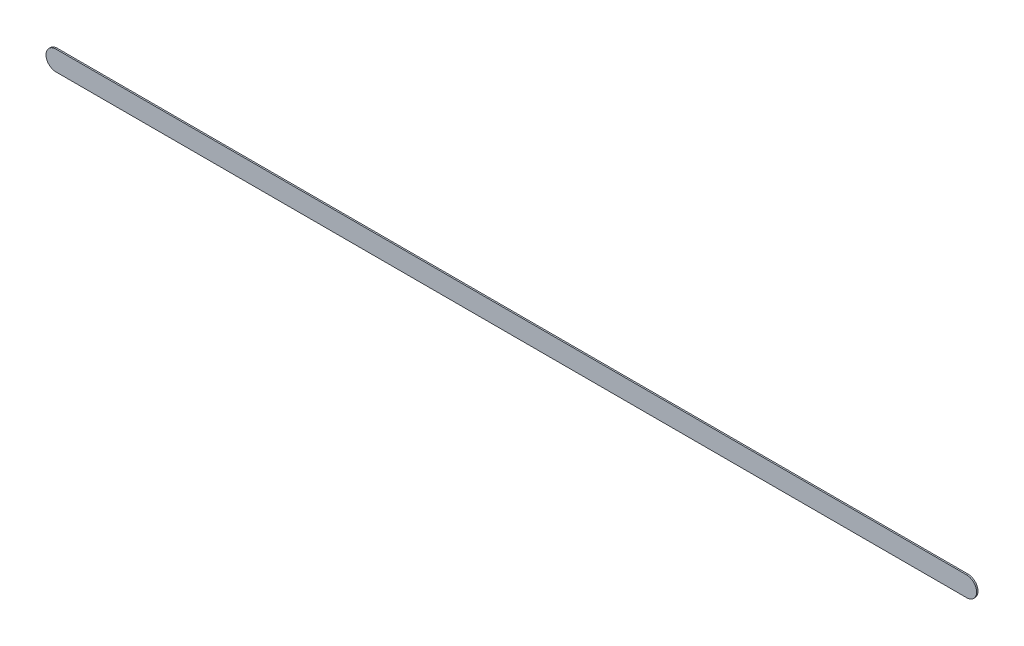
ISO-10303-21;
HEADER;
FILE_DESCRIPTION(('STEP AP214'),'2;1');
FILE_NAME('part.step','',(''),(''),'','','');
FILE_SCHEMA(('AUTOMOTIVE_DESIGN { 1 0 10303 214 1 1 1 1 }'));
ENDSEC;
DATA;
#1=APPLICATION_CONTEXT('core data for automotive mechanical design processes');
#2=APPLICATION_PROTOCOL_DEFINITION('international standard','automotive_design',2000,#1);
#3=PRODUCT_CONTEXT('',#1,'mechanical');
#4=PRODUCT('Part','Part','',(#3));
#5=PRODUCT_RELATED_PRODUCT_CATEGORY('part','',(#4));
#6=PRODUCT_DEFINITION_FORMATION('','',#4);
#7=PRODUCT_DEFINITION_CONTEXT('part definition',#1,'design');
#8=PRODUCT_DEFINITION('design','',#6,#7);
#9=PRODUCT_DEFINITION_SHAPE('','',#8);
#10=(LENGTH_UNIT() NAMED_UNIT(*) SI_UNIT(.MILLI.,.METRE.));
#11=(NAMED_UNIT(*) PLANE_ANGLE_UNIT() SI_UNIT($,.RADIAN.));
#12=(NAMED_UNIT(*) SI_UNIT($,.STERADIAN.) SOLID_ANGLE_UNIT());
#13=UNCERTAINTY_MEASURE_WITH_UNIT(LENGTH_MEASURE(1.E-05),#10,'distance_accuracy_value','');
#14=(GEOMETRIC_REPRESENTATION_CONTEXT(3) GLOBAL_UNCERTAINTY_ASSIGNED_CONTEXT((#13)) GLOBAL_UNIT_ASSIGNED_CONTEXT((#10,
#11,#12)) REPRESENTATION_CONTEXT('',''));
#15=CARTESIAN_POINT('',(0.,0.,0.));
#16=DIRECTION('',(0.,0.,1.));
#17=DIRECTION('',(1.,0.,0.));
#18=AXIS2_PLACEMENT_3D('',#15,#16,#17);
#19=CARTESIAN_POINT('',(62.89999866,92.74999992,0.));
#20=DIRECTION('',(0.,1.,0.));
#21=DIRECTION('',(1.,0.,0.));
#22=AXIS2_PLACEMENT_3D('',#19,#20,#21);
#23=PLANE('',#22);
#24=DIRECTION('',(1.,0.,0.));
#25=VECTOR('',#24,1.);
#26=CARTESIAN_POINT('',(62.89999866,92.74999992,0.03556));
#27=LINE('',#26,#25);
#28=CARTESIAN_POINT('',(62.89999866,92.74999992,0.03556));
#29=VERTEX_POINT('',#28);
#30=CARTESIAN_POINT('',(85.89999838,92.74999992,0.03556));
#31=VERTEX_POINT('',#30);
#32=EDGE_CURVE('E11',#29,#31,#27,.T.);
#33=ORIENTED_EDGE('',*,*,#32,.F.);
#34=DIRECTION('',(0.,0.,1.));
#35=VECTOR('',#34,1.);
#36=CARTESIAN_POINT('',(62.89999866,92.74999992,0.));
#37=LINE('',#36,#35);
#38=CARTESIAN_POINT('',(62.89999866,92.74999992,0.));
#39=VERTEX_POINT('',#38);
#40=EDGE_CURVE('E24',#39,#29,#37,.T.);
#41=ORIENTED_EDGE('',*,*,#40,.F.);
#42=DIRECTION('',(1.,0.,0.));
#43=VECTOR('',#42,1.);
#44=CARTESIAN_POINT('',(62.89999866,92.74999992,0.));
#45=LINE('',#44,#43);
#46=CARTESIAN_POINT('',(85.89999838,92.74999992,0.));
#47=VERTEX_POINT('',#46);
#48=EDGE_CURVE('E75',#39,#47,#45,.T.);
#49=ORIENTED_EDGE('',*,*,#48,.T.);
#50=DIRECTION('',(0.,0.,1.));
#51=VECTOR('',#50,1.);
#52=CARTESIAN_POINT('',(85.89999838,92.74999992,0.));
#53=LINE('',#52,#51);
#54=EDGE_CURVE('E37',#47,#31,#53,.T.);
#55=ORIENTED_EDGE('',*,*,#54,.T.);
#56=EDGE_LOOP('',(#33,#41,#49,#55));
#57=FACE_BOUND('',#56,.T.);
#58=ADVANCED_FACE('F17',(#57),#23,.F.);
#59=CARTESIAN_POINT('',(85.89999838,92.99999942,0.));
#60=DIRECTION('',(0.,0.,-1.));
#61=DIRECTION('',(0.,-1.,0.));
#62=AXIS2_PLACEMENT_3D('',#59,#60,#61);
#63=CYLINDRICAL_SURFACE('',#62,0.249999500000001);
#64=CARTESIAN_POINT('',(85.89999838,92.99999942,0.03556));
#65=DIRECTION('',(0.,0.,1.));
#66=DIRECTION('',(0.,-1.,0.));
#67=AXIS2_PLACEMENT_3D('',#64,#65,#66);
#68=CIRCLE('',#67,0.249999500000001);
#69=CARTESIAN_POINT('',(85.89999838,93.24999892,0.03556));
#70=VERTEX_POINT('',#69);
#71=EDGE_CURVE('E83',#31,#70,#68,.T.);
#72=ORIENTED_EDGE('',*,*,#71,.F.);
#73=ORIENTED_EDGE('',*,*,#54,.F.);
#74=CARTESIAN_POINT('',(85.89999838,92.99999942,0.));
#75=DIRECTION('',(0.,0.,1.));
#76=DIRECTION('',(0.,-1.,0.));
#77=AXIS2_PLACEMENT_3D('',#74,#75,#76);
#78=CIRCLE('',#77,0.249999500000001);
#79=CARTESIAN_POINT('',(85.89999838,93.24999892,0.));
#80=VERTEX_POINT('',#79);
#81=EDGE_CURVE('E81',#47,#80,#78,.T.);
#82=ORIENTED_EDGE('',*,*,#81,.T.);
#83=DIRECTION('',(0.,0.,1.));
#84=VECTOR('',#83,1.);
#85=CARTESIAN_POINT('',(85.89999838,93.24999892,0.));
#86=LINE('',#85,#84);
#87=EDGE_CURVE('E67',#80,#70,#86,.T.);
#88=ORIENTED_EDGE('',*,*,#87,.T.);
#89=EDGE_LOOP('',(#72,#73,#82,#88));
#90=FACE_BOUND('',#89,.T.);
#91=ADVANCED_FACE('F89',(#90),#63,.T.);
#92=CARTESIAN_POINT('',(85.89999838,93.24999892,0.));
#93=DIRECTION('',(0.,-1.,0.));
#94=DIRECTION('',(-1.,0.,0.));
#95=AXIS2_PLACEMENT_3D('',#92,#93,#94);
#96=PLANE('',#95);
#97=DIRECTION('',(-1.,0.,0.));
#98=VECTOR('',#97,1.);
#99=CARTESIAN_POINT('',(85.89999838,93.24999892,0.03556));
#100=LINE('',#99,#98);
#101=CARTESIAN_POINT('',(62.89999866,93.24999892,0.03556));
#102=VERTEX_POINT('',#101);
#103=EDGE_CURVE('E71',#70,#102,#100,.T.);
#104=ORIENTED_EDGE('',*,*,#103,.F.);
#105=ORIENTED_EDGE('',*,*,#87,.F.);
#106=DIRECTION('',(-1.,0.,0.));
#107=VECTOR('',#106,1.);
#108=CARTESIAN_POINT('',(85.89999838,93.24999892,0.));
#109=LINE('',#108,#107);
#110=CARTESIAN_POINT('',(62.89999866,93.24999892,0.));
#111=VERTEX_POINT('',#110);
#112=EDGE_CURVE('E63',#80,#111,#109,.T.);
#113=ORIENTED_EDGE('',*,*,#112,.T.);
#114=DIRECTION('',(0.,0.,1.));
#115=VECTOR('',#114,1.);
#116=CARTESIAN_POINT('',(62.89999866,93.24999892,0.));
#117=LINE('',#116,#115);
#118=EDGE_CURVE('E53',#111,#102,#117,.T.);
#119=ORIENTED_EDGE('',*,*,#118,.T.);
#120=EDGE_LOOP('',(#104,#105,#113,#119));
#121=FACE_BOUND('',#120,.T.);
#122=ADVANCED_FACE('F66',(#121),#96,.F.);
#123=CARTESIAN_POINT('',(62.89999866,92.99999942,0.));
#124=DIRECTION('',(0.,0.,-1.));
#125=DIRECTION('',(0.,1.,0.));
#126=AXIS2_PLACEMENT_3D('',#123,#124,#125);
#127=CYLINDRICAL_SURFACE('',#126,0.249999500000001);
#128=CARTESIAN_POINT('',(62.89999866,92.99999942,0.03556));
#129=DIRECTION('',(0.,0.,1.));
#130=DIRECTION('',(0.,1.,0.));
#131=AXIS2_PLACEMENT_3D('',#128,#129,#130);
#132=CIRCLE('',#131,0.249999500000001);
#133=EDGE_CURVE('E59',#102,#29,#132,.T.);
#134=ORIENTED_EDGE('',*,*,#133,.F.);
#135=ORIENTED_EDGE('',*,*,#118,.F.);
#136=CARTESIAN_POINT('',(62.89999866,92.99999942,0.));
#137=DIRECTION('',(0.,0.,1.));
#138=DIRECTION('',(0.,1.,0.));
#139=AXIS2_PLACEMENT_3D('',#136,#137,#138);
#140=CIRCLE('',#139,0.249999500000001);
#141=EDGE_CURVE('E57',#111,#39,#140,.T.);
#142=ORIENTED_EDGE('',*,*,#141,.T.);
#143=ORIENTED_EDGE('',*,*,#40,.T.);
#144=EDGE_LOOP('',(#134,#135,#142,#143));
#145=FACE_BOUND('',#144,.T.);
#146=ADVANCED_FACE('F55',(#145),#127,.T.);
#147=CARTESIAN_POINT('',(62.89999866,92.74999992,0.));
#148=DIRECTION('',(0.,0.,-1.));
#149=DIRECTION('',(-1.,0.,0.));
#150=AXIS2_PLACEMENT_3D('',#147,#148,#149);
#151=PLANE('',#150);
#152=ORIENTED_EDGE('',*,*,#141,.F.);
#153=ORIENTED_EDGE('',*,*,#112,.F.);
#154=ORIENTED_EDGE('',*,*,#81,.F.);
#155=ORIENTED_EDGE('',*,*,#48,.F.);
#156=EDGE_LOOP('',(#152,#153,#154,#155));
#157=FACE_BOUND('',#156,.T.);
#158=ADVANCED_FACE('F74',(#157),#151,.T.);
#159=CARTESIAN_POINT('',(62.89999866,92.74999992,0.03556));
#160=DIRECTION('',(0.,0.,-1.));
#161=DIRECTION('',(-1.,0.,0.));
#162=AXIS2_PLACEMENT_3D('',#159,#160,#161);
#163=PLANE('',#162);
#164=ORIENTED_EDGE('',*,*,#32,.T.);
#165=ORIENTED_EDGE('',*,*,#71,.T.);
#166=ORIENTED_EDGE('',*,*,#103,.T.);
#167=ORIENTED_EDGE('',*,*,#133,.T.);
#168=EDGE_LOOP('',(#164,#165,#166,#167));
#169=FACE_BOUND('',#168,.T.);
#170=ADVANCED_FACE('F91',(#169),#163,.F.);
#171=CLOSED_SHELL('',(#58,#91,#122,#146,#158,#170));
#172=MANIFOLD_SOLID_BREP('B1',#171);
#173=ADVANCED_BREP_SHAPE_REPRESENTATION('',(#18,#172),#14);
#174=SHAPE_DEFINITION_REPRESENTATION(#9,#173);
ENDSEC;
END-ISO-10303-21;
